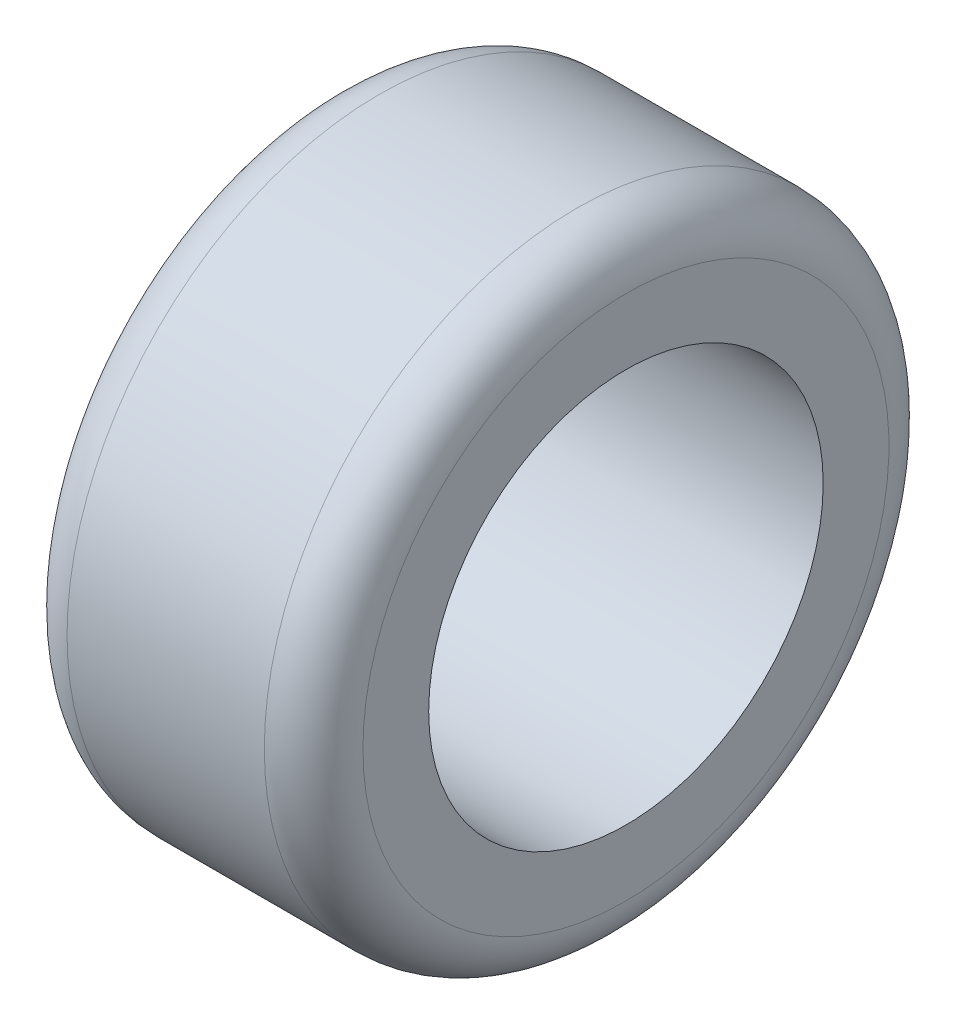
ISO-10303-21;
HEADER;
FILE_DESCRIPTION(('STEP AP214'),'2;1');
FILE_NAME('part.step','',(''),(''),'','','');
FILE_SCHEMA(('AUTOMOTIVE_DESIGN { 1 0 10303 214 1 1 1 1 }'));
ENDSEC;
DATA;
#1=APPLICATION_CONTEXT('core data for automotive mechanical design processes');
#2=APPLICATION_PROTOCOL_DEFINITION('international standard','automotive_design',2000,#1);
#3=PRODUCT_CONTEXT('',#1,'mechanical');
#4=PRODUCT('Part','Part','',(#3));
#5=PRODUCT_RELATED_PRODUCT_CATEGORY('part','',(#4));
#6=PRODUCT_DEFINITION_FORMATION('','',#4);
#7=PRODUCT_DEFINITION_CONTEXT('part definition',#1,'design');
#8=PRODUCT_DEFINITION('design','',#6,#7);
#9=PRODUCT_DEFINITION_SHAPE('','',#8);
#10=(LENGTH_UNIT() NAMED_UNIT(*) SI_UNIT(.MILLI.,.METRE.));
#11=(NAMED_UNIT(*) PLANE_ANGLE_UNIT() SI_UNIT($,.RADIAN.));
#12=(NAMED_UNIT(*) SI_UNIT($,.STERADIAN.) SOLID_ANGLE_UNIT());
#13=UNCERTAINTY_MEASURE_WITH_UNIT(LENGTH_MEASURE(1.E-05),#10,'distance_accuracy_value','');
#14=(GEOMETRIC_REPRESENTATION_CONTEXT(3) GLOBAL_UNCERTAINTY_ASSIGNED_CONTEXT((#13)) GLOBAL_UNIT_ASSIGNED_CONTEXT((#10,
#11,#12)) REPRESENTATION_CONTEXT('',''));
#15=CARTESIAN_POINT('',(0.,0.,0.));
#16=DIRECTION('',(0.,0.,1.));
#17=DIRECTION('',(1.,0.,0.));
#18=AXIS2_PLACEMENT_3D('',#15,#16,#17);
#19=CARTESIAN_POINT('',(-7.54612202688729,0.,0.));
#20=DIRECTION('',(-1.,0.,0.));
#21=DIRECTION('',(0.,0.,1.));
#22=AXIS2_PLACEMENT_3D('',#19,#20,#21);
#23=TOROIDAL_SURFACE('',#22,16.,3.);
#24=CARTESIAN_POINT('',(-10.5461220268873,0.,0.));
#25=DIRECTION('',(-1.,0.,0.));
#26=DIRECTION('',(0.,0.,1.));
#27=AXIS2_PLACEMENT_3D('',#24,#25,#26);
#28=CIRCLE('',#27,16.);
#29=CARTESIAN_POINT('',(-10.5461220268873,0.,16.));
#30=VERTEX_POINT('',#29);
#31=EDGE_CURVE('E47',#30,#30,#28,.T.);
#32=ORIENTED_EDGE('',*,*,#31,.F.);
#33=EDGE_LOOP('',(#32));
#34=FACE_BOUND('',#33,.T.);
#35=CARTESIAN_POINT('',(-7.54612202688727,0.,0.));
#36=DIRECTION('',(-1.,0.,0.));
#37=DIRECTION('',(0.,0.,1.));
#38=AXIS2_PLACEMENT_3D('',#35,#36,#37);
#39=CIRCLE('',#38,19.);
#40=CARTESIAN_POINT('',(-7.54612202688727,0.,19.));
#41=VERTEX_POINT('',#40);
#42=EDGE_CURVE('E10',#41,#41,#39,.T.);
#43=ORIENTED_EDGE('',*,*,#42,.T.);
#44=EDGE_LOOP('',(#43));
#45=FACE_BOUND('',#44,.T.);
#46=ADVANCED_FACE('F25',(#34,#45),#23,.T.);
#47=CARTESIAN_POINT('',(-38.2838676318511,0.,0.));
#48=DIRECTION('',(-1.,0.,0.));
#49=DIRECTION('',(0.,0.,1.));
#50=AXIS2_PLACEMENT_3D('',#47,#48,#49);
#51=CYLINDRICAL_SURFACE('',#50,19.);
#52=ORIENTED_EDGE('',*,*,#42,.F.);
#53=EDGE_LOOP('',(#52));
#54=FACE_BOUND('',#53,.T.);
#55=CARTESIAN_POINT('',(4.45387797311269,0.,0.));
#56=DIRECTION('',(-1.,0.,0.));
#57=DIRECTION('',(0.,0.,1.));
#58=AXIS2_PLACEMENT_3D('',#55,#56,#57);
#59=CIRCLE('',#58,19.);
#60=CARTESIAN_POINT('',(4.45387797311269,0.,19.));
#61=VERTEX_POINT('',#60);
#62=EDGE_CURVE('E31',#61,#61,#59,.T.);
#63=ORIENTED_EDGE('',*,*,#62,.T.);
#64=EDGE_LOOP('',(#63));
#65=FACE_BOUND('',#64,.T.);
#66=ADVANCED_FACE('F54',(#54,#65),#51,.T.);
#67=CARTESIAN_POINT('',(4.45387797311271,0.,0.));
#68=DIRECTION('',(-1.,0.,0.));
#69=DIRECTION('',(0.,0.,1.));
#70=AXIS2_PLACEMENT_3D('',#67,#68,#69);
#71=TOROIDAL_SURFACE('',#70,16.,3.);
#72=ORIENTED_EDGE('',*,*,#62,.F.);
#73=EDGE_LOOP('',(#72));
#74=FACE_BOUND('',#73,.T.);
#75=CARTESIAN_POINT('',(7.45387797311271,0.,0.));
#76=DIRECTION('',(-1.,0.,0.));
#77=DIRECTION('',(0.,0.,1.));
#78=AXIS2_PLACEMENT_3D('',#75,#76,#77);
#79=CIRCLE('',#78,16.);
#80=CARTESIAN_POINT('',(7.45387797311271,0.,16.));
#81=VERTEX_POINT('',#80);
#82=EDGE_CURVE('E35',#81,#81,#79,.T.);
#83=ORIENTED_EDGE('',*,*,#82,.T.);
#84=EDGE_LOOP('',(#83));
#85=FACE_BOUND('',#84,.T.);
#86=ADVANCED_FACE('F58',(#74,#85),#71,.T.);
#87=CARTESIAN_POINT('',(7.45387797311271,12.,0.));
#88=DIRECTION('',(-1.,0.,0.));
#89=DIRECTION('',(0.,0.,1.));
#90=AXIS2_PLACEMENT_3D('',#87,#88,#89);
#91=PLANE('',#90);
#92=ORIENTED_EDGE('',*,*,#82,.F.);
#93=EDGE_LOOP('',(#92));
#94=FACE_BOUND('',#93,.T.);
#95=CARTESIAN_POINT('',(7.45387797311271,0.,0.));
#96=DIRECTION('',(-1.,0.,0.));
#97=DIRECTION('',(0.,0.,1.));
#98=AXIS2_PLACEMENT_3D('',#95,#96,#97);
#99=CIRCLE('',#98,12.);
#100=CARTESIAN_POINT('',(7.45387797311271,0.,12.));
#101=VERTEX_POINT('',#100);
#102=EDGE_CURVE('E39',#101,#101,#99,.T.);
#103=ORIENTED_EDGE('',*,*,#102,.T.);
#104=EDGE_LOOP('',(#103));
#105=FACE_BOUND('',#104,.T.);
#106=ADVANCED_FACE('F63',(#94,#105),#91,.F.);
#107=CARTESIAN_POINT('',(-38.2838676318511,0.,0.));
#108=DIRECTION('',(-1.,0.,0.));
#109=DIRECTION('',(0.,0.,1.));
#110=AXIS2_PLACEMENT_3D('',#107,#108,#109);
#111=CYLINDRICAL_SURFACE('',#110,12.);
#112=ORIENTED_EDGE('',*,*,#102,.F.);
#113=EDGE_LOOP('',(#112));
#114=FACE_BOUND('',#113,.T.);
#115=CARTESIAN_POINT('',(-10.5461220268873,0.,0.));
#116=DIRECTION('',(-1.,0.,0.));
#117=DIRECTION('',(0.,0.,1.));
#118=AXIS2_PLACEMENT_3D('',#115,#116,#117);
#119=CIRCLE('',#118,12.);
#120=CARTESIAN_POINT('',(-10.5461220268873,0.,12.));
#121=VERTEX_POINT('',#120);
#122=EDGE_CURVE('E44',#121,#121,#119,.T.);
#123=ORIENTED_EDGE('',*,*,#122,.T.);
#124=EDGE_LOOP('',(#123));
#125=FACE_BOUND('',#124,.T.);
#126=ADVANCED_FACE('F69',(#114,#125),#111,.F.);
#127=CARTESIAN_POINT('',(-10.5461220268873,12.,0.));
#128=DIRECTION('',(1.,0.,0.));
#129=DIRECTION('',(0.,0.,-1.));
#130=AXIS2_PLACEMENT_3D('',#127,#128,#129);
#131=PLANE('',#130);
#132=ORIENTED_EDGE('',*,*,#122,.F.);
#133=EDGE_LOOP('',(#132));
#134=FACE_BOUND('',#133,.T.);
#135=ORIENTED_EDGE('',*,*,#31,.T.);
#136=EDGE_LOOP('',(#135));
#137=FACE_BOUND('',#136,.T.);
#138=ADVANCED_FACE('F51',(#134,#137),#131,.F.);
#139=CLOSED_SHELL('',(#46,#66,#86,#106,#126,#138));
#140=MANIFOLD_SOLID_BREP('B2',#139);
#141=ADVANCED_BREP_SHAPE_REPRESENTATION('',(#18,#140),#14);
#142=SHAPE_DEFINITION_REPRESENTATION(#9,#141);
ENDSEC;
END-ISO-10303-21;
